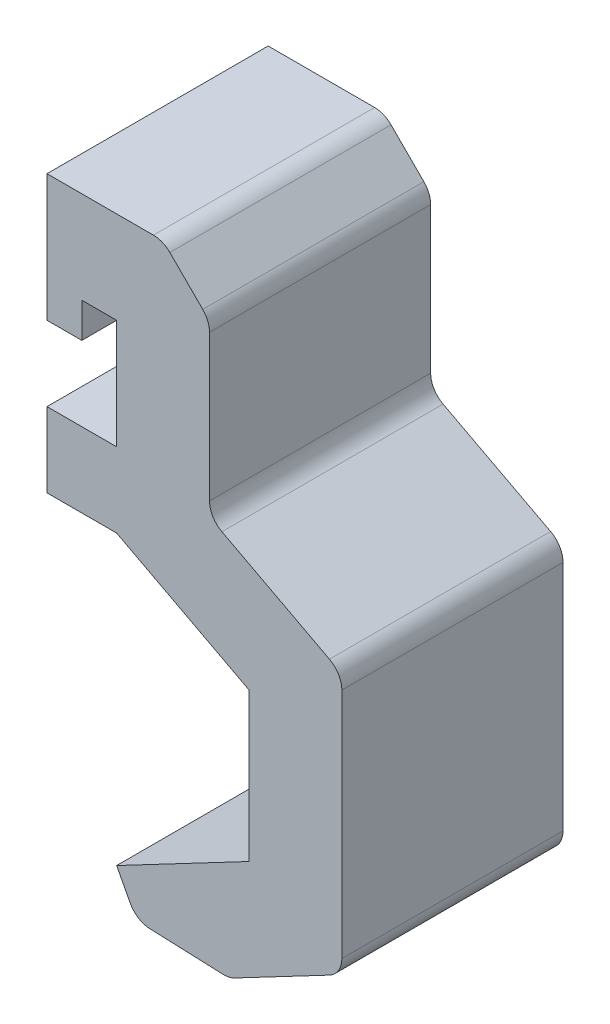
ISO-10303-21;
HEADER;
FILE_DESCRIPTION(('STEP AP214'),'2;1');
FILE_NAME('part.step','',(''),(''),'','','');
FILE_SCHEMA(('AUTOMOTIVE_DESIGN { 1 0 10303 214 1 1 1 1 }'));
ENDSEC;
DATA;
#1=APPLICATION_CONTEXT('core data for automotive mechanical design processes');
#2=APPLICATION_PROTOCOL_DEFINITION('international standard','automotive_design',2000,#1);
#3=PRODUCT_CONTEXT('',#1,'mechanical');
#4=PRODUCT('Part','Part','',(#3));
#5=PRODUCT_RELATED_PRODUCT_CATEGORY('part','',(#4));
#6=PRODUCT_DEFINITION_FORMATION('','',#4);
#7=PRODUCT_DEFINITION_CONTEXT('part definition',#1,'design');
#8=PRODUCT_DEFINITION('design','',#6,#7);
#9=PRODUCT_DEFINITION_SHAPE('','',#8);
#10=(LENGTH_UNIT() NAMED_UNIT(*) SI_UNIT(.MILLI.,.METRE.));
#11=(NAMED_UNIT(*) PLANE_ANGLE_UNIT() SI_UNIT($,.RADIAN.));
#12=(NAMED_UNIT(*) SI_UNIT($,.STERADIAN.) SOLID_ANGLE_UNIT());
#13=UNCERTAINTY_MEASURE_WITH_UNIT(LENGTH_MEASURE(1.E-05),#10,'distance_accuracy_value','');
#14=(GEOMETRIC_REPRESENTATION_CONTEXT(3) GLOBAL_UNCERTAINTY_ASSIGNED_CONTEXT((#13)) GLOBAL_UNIT_ASSIGNED_CONTEXT((#10,
#11,#12)) REPRESENTATION_CONTEXT('',''));
#15=CARTESIAN_POINT('',(0.,0.,0.));
#16=DIRECTION('',(0.,0.,1.));
#17=DIRECTION('',(1.,0.,0.));
#18=AXIS2_PLACEMENT_3D('',#15,#16,#17);
#19=CARTESIAN_POINT('',(22.5,12.6474908997093,4.7625));
#20=DIRECTION('',(0.,1.,0.));
#21=DIRECTION('',(0.,0.,1.));
#22=AXIS2_PLACEMENT_3D('',#19,#20,#21);
#23=PLANE('',#22);
#24=DIRECTION('',(1.,0.,0.));
#25=VECTOR('',#24,1.);
#26=CARTESIAN_POINT('',(22.5,12.6474908997093,0.));
#27=LINE('',#26,#25);
#28=CARTESIAN_POINT('',(21.,12.6474908997093,0.));
#29=VERTEX_POINT('',#28);
#30=CARTESIAN_POINT('',(22.5,12.6474908997093,0.));
#31=VERTEX_POINT('',#30);
#32=EDGE_CURVE('E229',#29,#31,#27,.T.);
#33=ORIENTED_EDGE('',*,*,#32,.T.);
#34=DIRECTION('',(0.,0.,-1.));
#35=VECTOR('',#34,1.);
#36=CARTESIAN_POINT('',(22.5,12.6474908997093,4.7625));
#37=LINE('',#36,#35);
#38=CARTESIAN_POINT('',(22.5,12.6474908997093,4.7625));
#39=VERTEX_POINT('',#38);
#40=EDGE_CURVE('E209',#39,#31,#37,.T.);
#41=ORIENTED_EDGE('',*,*,#40,.F.);
#42=DIRECTION('',(1.,0.,0.));
#43=VECTOR('',#42,1.);
#44=CARTESIAN_POINT('',(22.5,12.6474908997093,4.7625));
#45=LINE('',#44,#43);
#46=CARTESIAN_POINT('',(21.,12.6474908997093,4.7625));
#47=VERTEX_POINT('',#46);
#48=EDGE_CURVE('E216',#47,#39,#45,.T.);
#49=ORIENTED_EDGE('',*,*,#48,.F.);
#50=DIRECTION('',(0.,0.,-1.));
#51=VECTOR('',#50,1.);
#52=CARTESIAN_POINT('',(21.,12.6474908997093,4.7625));
#53=LINE('',#52,#51);
#54=EDGE_CURVE('E361',#47,#29,#53,.T.);
#55=ORIENTED_EDGE('',*,*,#54,.T.);
#56=EDGE_LOOP('',(#33,#41,#49,#55));
#57=FACE_BOUND('',#56,.T.);
#58=ADVANCED_FACE('F30',(#57),#23,.F.);
#59=CARTESIAN_POINT('',(22.5,12.6474908997093,4.7625));
#60=DIRECTION('',(0.465746432832622,0.884918222381983,0.));
#61=DIRECTION('',(-0.884918222381983,0.465746432832622,0.));
#62=AXIS2_PLACEMENT_3D('',#59,#60,#61);
#63=PLANE('',#62);
#64=DIRECTION('',(0.884918222381983,-0.465746432832622,0.));
#65=VECTOR('',#64,1.);
#66=CARTESIAN_POINT('',(22.5,12.6474908997093,0.));
#67=LINE('',#66,#65);
#68=CARTESIAN_POINT('',(25.35,11.1474908997093,0.));
#69=VERTEX_POINT('',#68);
#70=EDGE_CURVE('E363',#31,#69,#67,.T.);
#71=ORIENTED_EDGE('',*,*,#70,.T.);
#72=DIRECTION('',(0.,0.,-1.));
#73=VECTOR('',#72,1.);
#74=CARTESIAN_POINT('',(25.35,11.1474908997093,4.7625));
#75=LINE('',#74,#73);
#76=CARTESIAN_POINT('',(25.35,11.1474908997093,4.7625));
#77=VERTEX_POINT('',#76);
#78=EDGE_CURVE('E212',#77,#69,#75,.T.);
#79=ORIENTED_EDGE('',*,*,#78,.F.);
#80=DIRECTION('',(0.884918222381983,-0.465746432832622,0.));
#81=VECTOR('',#80,1.);
#82=CARTESIAN_POINT('',(22.5,12.6474908997093,4.7625));
#83=LINE('',#82,#81);
#84=EDGE_CURVE('E205',#39,#77,#83,.T.);
#85=ORIENTED_EDGE('',*,*,#84,.F.);
#86=ORIENTED_EDGE('',*,*,#40,.T.);
#87=EDGE_LOOP('',(#71,#79,#85,#86));
#88=FACE_BOUND('',#87,.T.);
#89=ADVANCED_FACE('F207',(#88),#63,.F.);
#90=CARTESIAN_POINT('',(25.35,11.1474908997093,4.7625));
#91=DIRECTION('',(1.,0.,0.));
#92=DIRECTION('',(0.,0.,-1.));
#93=AXIS2_PLACEMENT_3D('',#90,#91,#92);
#94=PLANE('',#93);
#95=DIRECTION('',(0.,-1.,0.));
#96=VECTOR('',#95,1.);
#97=CARTESIAN_POINT('',(25.35,11.1474908997093,0.));
#98=LINE('',#97,#96);
#99=CARTESIAN_POINT('',(25.35,7.94749089970934,0.));
#100=VERTEX_POINT('',#99);
#101=EDGE_CURVE('E365',#69,#100,#98,.T.);
#102=ORIENTED_EDGE('',*,*,#101,.T.);
#103=DIRECTION('',(0.,0.,-1.));
#104=VECTOR('',#103,1.);
#105=CARTESIAN_POINT('',(25.35,7.94749089970934,4.7625));
#106=LINE('',#105,#104);
#107=CARTESIAN_POINT('',(25.35,7.94749089970934,4.7625));
#108=VERTEX_POINT('',#107);
#109=EDGE_CURVE('E235',#108,#100,#106,.T.);
#110=ORIENTED_EDGE('',*,*,#109,.F.);
#111=DIRECTION('',(0.,-1.,0.));
#112=VECTOR('',#111,1.);
#113=CARTESIAN_POINT('',(25.35,11.1474908997093,4.7625));
#114=LINE('',#113,#112);
#115=EDGE_CURVE('E215',#77,#108,#114,.T.);
#116=ORIENTED_EDGE('',*,*,#115,.F.);
#117=ORIENTED_EDGE('',*,*,#78,.T.);
#118=EDGE_LOOP('',(#102,#110,#116,#117));
#119=FACE_BOUND('',#118,.T.);
#120=ADVANCED_FACE('F422',(#119),#94,.F.);
#121=CARTESIAN_POINT('',(25.35,7.94749089970934,4.7625));
#122=DIRECTION('',(0.465746432832622,-0.884918222381983,0.));
#123=DIRECTION('',(0.884918222381983,0.465746432832622,0.));
#124=AXIS2_PLACEMENT_3D('',#121,#122,#123);
#125=PLANE('',#124);
#126=DIRECTION('',(-0.884918222381983,-0.465746432832622,0.));
#127=VECTOR('',#126,1.);
#128=CARTESIAN_POINT('',(25.35,7.94749089970934,0.));
#129=LINE('',#128,#127);
#130=CARTESIAN_POINT('',(22.5,6.44749089970934,0.));
#131=VERTEX_POINT('',#130);
#132=EDGE_CURVE('E319',#100,#131,#129,.T.);
#133=ORIENTED_EDGE('',*,*,#132,.T.);
#134=DIRECTION('',(0.,0.,-1.));
#135=VECTOR('',#134,1.);
#136=CARTESIAN_POINT('',(22.5,6.44749089970934,4.7625));
#137=LINE('',#136,#135);
#138=CARTESIAN_POINT('',(22.5,6.44749089970934,4.7625));
#139=VERTEX_POINT('',#138);
#140=EDGE_CURVE('E317',#139,#131,#137,.T.);
#141=ORIENTED_EDGE('',*,*,#140,.F.);
#142=DIRECTION('',(-0.884918222381983,-0.465746432832622,0.));
#143=VECTOR('',#142,1.);
#144=CARTESIAN_POINT('',(25.35,7.94749089970934,4.7625));
#145=LINE('',#144,#143);
#146=EDGE_CURVE('E337',#108,#139,#145,.T.);
#147=ORIENTED_EDGE('',*,*,#146,.F.);
#148=ORIENTED_EDGE('',*,*,#109,.T.);
#149=EDGE_LOOP('',(#133,#141,#147,#148));
#150=FACE_BOUND('',#149,.T.);
#151=ADVANCED_FACE('F419',(#150),#125,.F.);
#152=CARTESIAN_POINT('',(23.392083301161,4.75253262750349,4.7625));
#153=DIRECTION('',(0.884918222381983,0.465746432832622,0.));
#154=DIRECTION('',(-0.465746432832622,0.884918222381983,0.));
#155=AXIS2_PLACEMENT_3D('',#152,#153,#154);
#156=PLANE('',#155);
#157=DIRECTION('',(0.465746432832621,-0.884918222381983,0.));
#158=VECTOR('',#157,1.);
#159=CARTESIAN_POINT('',(23.392083301161,4.75253262750349,0.));
#160=LINE('',#159,#158);
#161=CARTESIAN_POINT('',(22.7918874541433,5.89290473683699,0.));
#162=VERTEX_POINT('',#161);
#163=EDGE_CURVE('E309',#131,#162,#160,.T.);
#164=ORIENTED_EDGE('',*,*,#163,.T.);
#165=DIRECTION('',(0.,0.,-1.));
#166=VECTOR('',#165,1.);
#167=CARTESIAN_POINT('',(22.7918874541433,5.89290473683699,4.7625));
#168=LINE('',#167,#166);
#169=CARTESIAN_POINT('',(22.7918874541433,5.89290473683699,4.7625));
#170=VERTEX_POINT('',#169);
#171=EDGE_CURVE('E293',#162,#170,#168,.F.);
#172=ORIENTED_EDGE('',*,*,#171,.T.);
#173=DIRECTION('',(0.465746432832621,-0.884918222381983,0.));
#174=VECTOR('',#173,1.);
#175=CARTESIAN_POINT('',(23.392083301161,4.75253262750349,4.7625));
#176=LINE('',#175,#174);
#177=EDGE_CURVE('E323',#139,#170,#176,.T.);
#178=ORIENTED_EDGE('',*,*,#177,.F.);
#179=ORIENTED_EDGE('',*,*,#140,.T.);
#180=EDGE_LOOP('',(#164,#172,#178,#179));
#181=FACE_BOUND('',#180,.T.);
#182=ADVANCED_FACE('F314',(#181),#156,.F.);
#183=CARTESIAN_POINT('',(27.35,6.83564667952403,4.7625));
#184=DIRECTION('',(-0.465746432832622,0.884918222381982,0.));
#185=DIRECTION('',(-0.884918222381983,-0.465746432832622,0.));
#186=AXIS2_PLACEMENT_3D('',#183,#184,#185);
#187=PLANE('',#186);
#188=DIRECTION('',(0.884918222381982,0.465746432832622,0.));
#189=VECTOR('',#188,1.);
#190=CARTESIAN_POINT('',(27.35,6.83564667952403,4.7625));
#191=LINE('',#190,#189);
#192=CARTESIAN_POINT('',(25.0433631843975,5.62162730289114,4.7625));
#193=VERTEX_POINT('',#192);
#194=CARTESIAN_POINT('',(27.0828732164163,6.69505363553261,4.7625));
#195=VERTEX_POINT('',#194);
#196=EDGE_CURVE('E326',#193,#195,#191,.T.);
#197=ORIENTED_EDGE('',*,*,#196,.F.);
#198=DIRECTION('',(0.,0.,1.));
#199=VECTOR('',#198,1.);
#200=CARTESIAN_POINT('',(25.0433631843975,5.62162730289114,0.));
#201=LINE('',#200,#199);
#202=CARTESIAN_POINT('',(25.0433631843975,5.62162730289114,0.));
#203=VERTEX_POINT('',#202);
#204=EDGE_CURVE('E11',#193,#203,#201,.F.);
#205=ORIENTED_EDGE('',*,*,#204,.T.);
#206=DIRECTION('',(0.884918222381982,0.465746432832622,0.));
#207=VECTOR('',#206,1.);
#208=CARTESIAN_POINT('',(27.35,6.83564667952403,0.));
#209=LINE('',#208,#207);
#210=CARTESIAN_POINT('',(27.0828732164163,6.69505363553261,0.));
#211=VERTEX_POINT('',#210);
#212=EDGE_CURVE('E318',#203,#211,#209,.T.);
#213=ORIENTED_EDGE('',*,*,#212,.T.);
#214=DIRECTION('',(0.,0.,-1.));
#215=VECTOR('',#214,1.);
#216=CARTESIAN_POINT('',(27.0828732164163,6.69505363553261,4.7625));
#217=LINE('',#216,#215);
#218=EDGE_CURVE('E255',#211,#195,#217,.F.);
#219=ORIENTED_EDGE('',*,*,#218,.T.);
#220=EDGE_LOOP('',(#197,#205,#213,#219));
#221=FACE_BOUND('',#220,.T.);
#222=ADVANCED_FACE('F328',(#221),#187,.F.);
#223=CARTESIAN_POINT('',(27.35,12.4468795175236,4.7625));
#224=DIRECTION('',(-1.,0.,0.));
#225=DIRECTION('',(0.,0.,1.));
#226=AXIS2_PLACEMENT_3D('',#223,#224,#225);
#227=PLANE('',#226);
#228=DIRECTION('',(0.,1.,0.));
#229=VECTOR('',#228,1.);
#230=CARTESIAN_POINT('',(27.35,12.4468795175236,4.7625));
#231=LINE('',#230,#229);
#232=CARTESIAN_POINT('',(27.35,7.1375127467236,4.7625));
#233=VERTEX_POINT('',#232);
#234=CARTESIAN_POINT('',(27.35,12.145013450324,4.7625));
#235=VERTEX_POINT('',#234);
#236=EDGE_CURVE('E332',#233,#235,#231,.T.);
#237=ORIENTED_EDGE('',*,*,#236,.F.);
#238=DIRECTION('',(0.,0.,-1.));
#239=VECTOR('',#238,1.);
#240=CARTESIAN_POINT('',(27.35,7.1375127467236,4.7625));
#241=LINE('',#240,#239);
#242=CARTESIAN_POINT('',(27.35,7.1375127467236,0.));
#243=VERTEX_POINT('',#242);
#244=EDGE_CURVE('E243',#233,#243,#241,.T.);
#245=ORIENTED_EDGE('',*,*,#244,.T.);
#246=DIRECTION('',(0.,1.,0.));
#247=VECTOR('',#246,1.);
#248=CARTESIAN_POINT('',(27.35,12.4468795175236,0.));
#249=LINE('',#248,#247);
#250=CARTESIAN_POINT('',(27.35,12.145013450324,0.));
#251=VERTEX_POINT('',#250);
#252=EDGE_CURVE('E369',#243,#251,#249,.T.);
#253=ORIENTED_EDGE('',*,*,#252,.T.);
#254=DIRECTION('',(0.,0.,-1.));
#255=VECTOR('',#254,1.);
#256=CARTESIAN_POINT('',(27.35,12.145013450324,4.7625));
#257=LINE('',#256,#255);
#258=EDGE_CURVE('E241',#251,#235,#257,.F.);
#259=ORIENTED_EDGE('',*,*,#258,.T.);
#260=EDGE_LOOP('',(#237,#245,#253,#259));
#261=FACE_BOUND('',#260,.T.);
#262=ADVANCED_FACE('F508',(#261),#227,.F.);
#263=CARTESIAN_POINT('',(24.5,13.9468795175236,4.7625));
#264=DIRECTION('',(-0.465746432832622,-0.884918222381982,0.));
#265=DIRECTION('',(0.884918222381983,-0.465746432832622,0.));
#266=AXIS2_PLACEMENT_3D('',#263,#264,#265);
#267=PLANE('',#266);
#268=DIRECTION('',(-0.884918222381982,0.465746432832622,0.));
#269=VECTOR('',#268,1.);
#270=CARTESIAN_POINT('',(24.5,13.9468795175236,4.7625));
#271=LINE('',#270,#269);
#272=CARTESIAN_POINT('',(27.0828732164163,12.587472561515,4.7625));
#273=VERTEX_POINT('',#272);
#274=CARTESIAN_POINT('',(24.7671267835837,13.8062864735322,4.7625));
#275=VERTEX_POINT('',#274);
#276=EDGE_CURVE('E335',#273,#275,#271,.T.);
#277=ORIENTED_EDGE('',*,*,#276,.F.);
#278=DIRECTION('',(0.,0.,-1.));
#279=VECTOR('',#278,1.);
#280=CARTESIAN_POINT('',(27.0828732164163,12.587472561515,4.7625));
#281=LINE('',#280,#279);
#282=CARTESIAN_POINT('',(27.0828732164163,12.587472561515,0.));
#283=VERTEX_POINT('',#282);
#284=EDGE_CURVE('E268',#273,#283,#281,.T.);
#285=ORIENTED_EDGE('',*,*,#284,.T.);
#286=DIRECTION('',(-0.884918222381982,0.465746432832622,0.));
#287=VECTOR('',#286,1.);
#288=CARTESIAN_POINT('',(24.5,13.9468795175236,0.));
#289=LINE('',#288,#287);
#290=CARTESIAN_POINT('',(24.7671267835837,13.8062864735322,0.));
#291=VERTEX_POINT('',#290);
#292=EDGE_CURVE('E372',#283,#291,#289,.T.);
#293=ORIENTED_EDGE('',*,*,#292,.T.);
#294=DIRECTION('',(0.,0.,-1.));
#295=VECTOR('',#294,1.);
#296=CARTESIAN_POINT('',(24.7671267835837,13.8062864735322,4.7625));
#297=LINE('',#296,#295);
#298=EDGE_CURVE('E266',#291,#275,#297,.F.);
#299=ORIENTED_EDGE('',*,*,#298,.T.);
#300=EDGE_LOOP('',(#277,#285,#293,#299));
#301=FACE_BOUND('',#300,.T.);
#302=ADVANCED_FACE('F577',(#301),#267,.F.);
#303=CARTESIAN_POINT('',(24.5,18.6006158997093,4.7625));
#304=DIRECTION('',(-1.,0.,0.));
#305=DIRECTION('',(0.,0.,1.));
#306=AXIS2_PLACEMENT_3D('',#303,#304,#305);
#307=PLANE('',#306);
#308=DIRECTION('',(0.,1.,0.));
#309=VECTOR('',#308,1.);
#310=CARTESIAN_POINT('',(24.5,18.6006158997093,4.7625));
#311=LINE('',#310,#309);
#312=CARTESIAN_POINT('',(24.5,14.2487455847232,4.7625));
#313=VERTEX_POINT('',#312);
#314=CARTESIAN_POINT('',(24.5,17.3935091185228,4.7625));
#315=VERTEX_POINT('',#314);
#316=EDGE_CURVE('E343',#313,#315,#311,.T.);
#317=ORIENTED_EDGE('',*,*,#316,.F.);
#318=DIRECTION('',(0.,0.,-1.));
#319=VECTOR('',#318,1.);
#320=CARTESIAN_POINT('',(24.5,14.2487455847232,0.));
#321=LINE('',#320,#319);
#322=CARTESIAN_POINT('',(24.5,14.2487455847232,0.));
#323=VERTEX_POINT('',#322);
#324=EDGE_CURVE('E274',#313,#323,#321,.T.);
#325=ORIENTED_EDGE('',*,*,#324,.T.);
#326=DIRECTION('',(0.,1.,0.));
#327=VECTOR('',#326,1.);
#328=CARTESIAN_POINT('',(24.5,18.6006158997093,0.));
#329=LINE('',#328,#327);
#330=CARTESIAN_POINT('',(24.5,17.3935091185228,0.));
#331=VERTEX_POINT('',#330);
#332=EDGE_CURVE('E375',#323,#331,#329,.T.);
#333=ORIENTED_EDGE('',*,*,#332,.T.);
#334=DIRECTION('',(0.,0.,-1.));
#335=VECTOR('',#334,1.);
#336=CARTESIAN_POINT('',(24.5,17.3935091185228,4.7625));
#337=LINE('',#336,#335);
#338=EDGE_CURVE('E271',#331,#315,#337,.F.);
#339=ORIENTED_EDGE('',*,*,#338,.T.);
#340=EDGE_LOOP('',(#317,#325,#333,#339));
#341=FACE_BOUND('',#340,.T.);
#342=ADVANCED_FACE('F564',(#341),#307,.F.);
#343=CARTESIAN_POINT('',(22.5,18.6006158997093,4.7625));
#344=DIRECTION('',(0.,-1.,0.));
#345=DIRECTION('',(1.,0.,0.));
#346=AXIS2_PLACEMENT_3D('',#343,#344,#345);
#347=PLANE('',#346);
#348=DIRECTION('',(-1.,0.,0.));
#349=VECTOR('',#348,1.);
#350=CARTESIAN_POINT('',(22.5,18.6006158997093,4.7625));
#351=LINE('',#350,#349);
#352=CARTESIAN_POINT('',(23.2928932188135,18.6006158997093,4.7625));
#353=VERTEX_POINT('',#352);
#354=CARTESIAN_POINT('',(21.,18.6006158997093,4.7625));
#355=VERTEX_POINT('',#354);
#356=EDGE_CURVE('E346',#353,#355,#351,.T.);
#357=ORIENTED_EDGE('',*,*,#356,.F.);
#358=DIRECTION('',(0.,0.,1.));
#359=VECTOR('',#358,1.);
#360=CARTESIAN_POINT('',(23.2928932188135,18.6006158997093,0.));
#361=LINE('',#360,#359);
#362=CARTESIAN_POINT('',(23.2928932188135,18.6006158997093,0.));
#363=VERTEX_POINT('',#362);
#364=EDGE_CURVE('E281',#353,#363,#361,.F.);
#365=ORIENTED_EDGE('',*,*,#364,.T.);
#366=DIRECTION('',(-1.,0.,0.));
#367=VECTOR('',#366,1.);
#368=CARTESIAN_POINT('',(22.5,18.6006158997093,0.));
#369=LINE('',#368,#367);
#370=CARTESIAN_POINT('',(21.,18.6006158997093,0.));
#371=VERTEX_POINT('',#370);
#372=EDGE_CURVE('E378',#363,#371,#369,.T.);
#373=ORIENTED_EDGE('',*,*,#372,.T.);
#374=DIRECTION('',(0.,0.,-1.));
#375=VECTOR('',#374,1.);
#376=CARTESIAN_POINT('',(21.,18.6006158997093,4.7625));
#377=LINE('',#376,#375);
#378=EDGE_CURVE('E412',#355,#371,#377,.T.);
#379=ORIENTED_EDGE('',*,*,#378,.F.);
#380=EDGE_LOOP('',(#357,#365,#373,#379));
#381=FACE_BOUND('',#380,.T.);
#382=ADVANCED_FACE('F558',(#381),#347,.F.);
#383=CARTESIAN_POINT('',(21.,16.6162408997093,4.7625));
#384=DIRECTION('',(1.,0.,0.));
#385=DIRECTION('',(0.,0.,-1.));
#386=AXIS2_PLACEMENT_3D('',#383,#384,#385);
#387=PLANE('',#386);
#388=DIRECTION('',(0.,-1.,0.));
#389=VECTOR('',#388,1.);
#390=CARTESIAN_POINT('',(21.,16.6162408997093,0.));
#391=LINE('',#390,#389);
#392=CARTESIAN_POINT('',(21.,15.8662408997093,0.));
#393=VERTEX_POINT('',#392);
#394=EDGE_CURVE('E380',#371,#393,#391,.T.);
#395=ORIENTED_EDGE('',*,*,#394,.T.);
#396=DIRECTION('',(0.,0.,-1.));
#397=VECTOR('',#396,1.);
#398=CARTESIAN_POINT('',(21.,15.8662408997093,4.7625));
#399=LINE('',#398,#397);
#400=CARTESIAN_POINT('',(21.,15.8662408997093,4.7625));
#401=VERTEX_POINT('',#400);
#402=EDGE_CURVE('E409',#401,#393,#399,.T.);
#403=ORIENTED_EDGE('',*,*,#402,.F.);
#404=DIRECTION('',(0.,-1.,0.));
#405=VECTOR('',#404,1.);
#406=CARTESIAN_POINT('',(21.,16.6162408997093,4.7625));
#407=LINE('',#406,#405);
#408=EDGE_CURVE('E348',#355,#401,#407,.T.);
#409=ORIENTED_EDGE('',*,*,#408,.F.);
#410=ORIENTED_EDGE('',*,*,#378,.T.);
#411=EDGE_LOOP('',(#395,#403,#409,#410));
#412=FACE_BOUND('',#411,.T.);
#413=ADVANCED_FACE('F563',(#412),#387,.F.);
#414=CARTESIAN_POINT('',(21.,15.8662408997093,4.7625));
#415=DIRECTION('',(0.,1.,0.));
#416=DIRECTION('',(0.,0.,1.));
#417=AXIS2_PLACEMENT_3D('',#414,#415,#416);
#418=PLANE('',#417);
#419=DIRECTION('',(1.,0.,0.));
#420=VECTOR('',#419,1.);
#421=CARTESIAN_POINT('',(21.,15.8662408997093,0.));
#422=LINE('',#421,#420);
#423=CARTESIAN_POINT('',(21.75,15.8662408997093,0.));
#424=VERTEX_POINT('',#423);
#425=EDGE_CURVE('E382',#393,#424,#422,.T.);
#426=ORIENTED_EDGE('',*,*,#425,.T.);
#427=DIRECTION('',(0.,0.,-1.));
#428=VECTOR('',#427,1.);
#429=CARTESIAN_POINT('',(21.75,15.8662408997093,4.7625));
#430=LINE('',#429,#428);
#431=CARTESIAN_POINT('',(21.75,15.8662408997093,4.7625));
#432=VERTEX_POINT('',#431);
#433=EDGE_CURVE('E406',#432,#424,#430,.T.);
#434=ORIENTED_EDGE('',*,*,#433,.F.);
#435=DIRECTION('',(1.,0.,0.));
#436=VECTOR('',#435,1.);
#437=CARTESIAN_POINT('',(21.,15.8662408997093,4.7625));
#438=LINE('',#437,#436);
#439=EDGE_CURVE('E350',#401,#432,#438,.T.);
#440=ORIENTED_EDGE('',*,*,#439,.F.);
#441=ORIENTED_EDGE('',*,*,#402,.T.);
#442=EDGE_LOOP('',(#426,#434,#440,#441));
#443=FACE_BOUND('',#442,.T.);
#444=ADVANCED_FACE('F641',(#443),#418,.F.);
#445=CARTESIAN_POINT('',(21.75,16.6162408997093,4.7625));
#446=DIRECTION('',(-1.,0.,0.));
#447=DIRECTION('',(0.,0.,1.));
#448=AXIS2_PLACEMENT_3D('',#445,#446,#447);
#449=PLANE('',#448);
#450=DIRECTION('',(0.,1.,0.));
#451=VECTOR('',#450,1.);
#452=CARTESIAN_POINT('',(21.75,16.6162408997093,0.));
#453=LINE('',#452,#451);
#454=CARTESIAN_POINT('',(21.75,16.6162408997093,0.));
#455=VERTEX_POINT('',#454);
#456=EDGE_CURVE('E384',#424,#455,#453,.T.);
#457=ORIENTED_EDGE('',*,*,#456,.T.);
#458=DIRECTION('',(0.,0.,-1.));
#459=VECTOR('',#458,1.);
#460=CARTESIAN_POINT('',(21.75,16.6162408997093,4.7625));
#461=LINE('',#460,#459);
#462=CARTESIAN_POINT('',(21.75,16.6162408997093,4.7625));
#463=VERTEX_POINT('',#462);
#464=EDGE_CURVE('E403',#463,#455,#461,.T.);
#465=ORIENTED_EDGE('',*,*,#464,.F.);
#466=DIRECTION('',(0.,1.,0.));
#467=VECTOR('',#466,1.);
#468=CARTESIAN_POINT('',(21.75,16.6162408997093,4.7625));
#469=LINE('',#468,#467);
#470=EDGE_CURVE('E352',#432,#463,#469,.T.);
#471=ORIENTED_EDGE('',*,*,#470,.F.);
#472=ORIENTED_EDGE('',*,*,#433,.T.);
#473=EDGE_LOOP('',(#457,#465,#471,#472));
#474=FACE_BOUND('',#473,.T.);
#475=ADVANCED_FACE('F631',(#474),#449,.F.);
#476=CARTESIAN_POINT('',(22.5,16.6162408997093,4.7625));
#477=DIRECTION('',(0.,1.,0.));
#478=DIRECTION('',(-1.,0.,0.));
#479=AXIS2_PLACEMENT_3D('',#476,#477,#478);
#480=PLANE('',#479);
#481=DIRECTION('',(1.,0.,0.));
#482=VECTOR('',#481,1.);
#483=CARTESIAN_POINT('',(22.5,16.6162408997093,0.));
#484=LINE('',#483,#482);
#485=CARTESIAN_POINT('',(22.5,16.6162408997093,0.));
#486=VERTEX_POINT('',#485);
#487=EDGE_CURVE('E386',#455,#486,#484,.T.);
#488=ORIENTED_EDGE('',*,*,#487,.T.);
#489=DIRECTION('',(0.,0.,-1.));
#490=VECTOR('',#489,1.);
#491=CARTESIAN_POINT('',(22.5,16.6162408997093,4.7625));
#492=LINE('',#491,#490);
#493=CARTESIAN_POINT('',(22.5,16.6162408997093,4.7625));
#494=VERTEX_POINT('',#493);
#495=EDGE_CURVE('E400',#494,#486,#492,.T.);
#496=ORIENTED_EDGE('',*,*,#495,.F.);
#497=DIRECTION('',(1.,0.,0.));
#498=VECTOR('',#497,1.);
#499=CARTESIAN_POINT('',(22.5,16.6162408997093,4.7625));
#500=LINE('',#499,#498);
#501=EDGE_CURVE('E354',#463,#494,#500,.T.);
#502=ORIENTED_EDGE('',*,*,#501,.F.);
#503=ORIENTED_EDGE('',*,*,#464,.T.);
#504=EDGE_LOOP('',(#488,#496,#502,#503));
#505=FACE_BOUND('',#504,.T.);
#506=ADVANCED_FACE('F621',(#505),#480,.F.);
#507=CARTESIAN_POINT('',(22.5,14.2568658997093,4.7625));
#508=DIRECTION('',(1.,0.,0.));
#509=DIRECTION('',(0.,0.,-1.));
#510=AXIS2_PLACEMENT_3D('',#507,#508,#509);
#511=PLANE('',#510);
#512=DIRECTION('',(0.,-1.,0.));
#513=VECTOR('',#512,1.);
#514=CARTESIAN_POINT('',(22.5,14.2568658997093,0.));
#515=LINE('',#514,#513);
#516=CARTESIAN_POINT('',(22.5,14.2568658997093,0.));
#517=VERTEX_POINT('',#516);
#518=EDGE_CURVE('E388',#486,#517,#515,.T.);
#519=ORIENTED_EDGE('',*,*,#518,.T.);
#520=DIRECTION('',(0.,0.,-1.));
#521=VECTOR('',#520,1.);
#522=CARTESIAN_POINT('',(22.5,14.2568658997093,4.7625));
#523=LINE('',#522,#521);
#524=CARTESIAN_POINT('',(22.5,14.2568658997093,4.7625));
#525=VERTEX_POINT('',#524);
#526=EDGE_CURVE('E397',#525,#517,#523,.T.);
#527=ORIENTED_EDGE('',*,*,#526,.F.);
#528=DIRECTION('',(0.,-1.,0.));
#529=VECTOR('',#528,1.);
#530=CARTESIAN_POINT('',(22.5,14.2568658997093,4.7625));
#531=LINE('',#530,#529);
#532=EDGE_CURVE('E356',#494,#525,#531,.T.);
#533=ORIENTED_EDGE('',*,*,#532,.F.);
#534=ORIENTED_EDGE('',*,*,#495,.T.);
#535=EDGE_LOOP('',(#519,#527,#533,#534));
#536=FACE_BOUND('',#535,.T.);
#537=ADVANCED_FACE('F611',(#536),#511,.F.);
#538=CARTESIAN_POINT('',(21.,14.2568658997093,4.7625));
#539=DIRECTION('',(0.,-1.,0.));
#540=DIRECTION('',(0.,0.,-1.));
#541=AXIS2_PLACEMENT_3D('',#538,#539,#540);
#542=PLANE('',#541);
#543=DIRECTION('',(-1.,0.,0.));
#544=VECTOR('',#543,1.);
#545=CARTESIAN_POINT('',(21.,14.2568658997093,0.));
#546=LINE('',#545,#544);
#547=CARTESIAN_POINT('',(21.,14.2568658997093,0.));
#548=VERTEX_POINT('',#547);
#549=EDGE_CURVE('E390',#517,#548,#546,.T.);
#550=ORIENTED_EDGE('',*,*,#549,.T.);
#551=DIRECTION('',(0.,0.,-1.));
#552=VECTOR('',#551,1.);
#553=CARTESIAN_POINT('',(21.,14.2568658997093,4.7625));
#554=LINE('',#553,#552);
#555=CARTESIAN_POINT('',(21.,14.2568658997093,4.7625));
#556=VERTEX_POINT('',#555);
#557=EDGE_CURVE('E394',#556,#548,#554,.T.);
#558=ORIENTED_EDGE('',*,*,#557,.F.);
#559=DIRECTION('',(-1.,0.,0.));
#560=VECTOR('',#559,1.);
#561=CARTESIAN_POINT('',(21.,14.2568658997093,4.7625));
#562=LINE('',#561,#560);
#563=EDGE_CURVE('E358',#525,#556,#562,.T.);
#564=ORIENTED_EDGE('',*,*,#563,.F.);
#565=ORIENTED_EDGE('',*,*,#526,.T.);
#566=EDGE_LOOP('',(#550,#558,#564,#565));
#567=FACE_BOUND('',#566,.T.);
#568=ADVANCED_FACE('F601',(#567),#542,.F.);
#569=CARTESIAN_POINT('',(21.,14.2568658997093,4.7625));
#570=DIRECTION('',(1.,0.,0.));
#571=DIRECTION('',(0.,1.,0.));
#572=AXIS2_PLACEMENT_3D('',#569,#570,#571);
#573=PLANE('',#572);
#574=DIRECTION('',(0.,-1.,0.));
#575=VECTOR('',#574,1.);
#576=CARTESIAN_POINT('',(21.,14.2568658997093,0.));
#577=LINE('',#576,#575);
#578=EDGE_CURVE('E226',#548,#29,#577,.T.);
#579=ORIENTED_EDGE('',*,*,#578,.T.);
#580=ORIENTED_EDGE('',*,*,#54,.F.);
#581=DIRECTION('',(0.,-1.,0.));
#582=VECTOR('',#581,1.);
#583=CARTESIAN_POINT('',(21.,14.2568658997093,4.7625));
#584=LINE('',#583,#582);
#585=EDGE_CURVE('E222',#556,#47,#584,.T.);
#586=ORIENTED_EDGE('',*,*,#585,.F.);
#587=ORIENTED_EDGE('',*,*,#557,.T.);
#588=EDGE_LOOP('',(#579,#580,#586,#587));
#589=FACE_BOUND('',#588,.T.);
#590=ADVANCED_FACE('F497',(#589),#573,.F.);
#591=CARTESIAN_POINT('',(21.,12.6474908997093,4.7625));
#592=DIRECTION('',(0.,0.,1.));
#593=DIRECTION('',(1.,0.,0.));
#594=AXIS2_PLACEMENT_3D('',#591,#592,#593);
#595=PLANE('',#594);
#596=ORIENTED_EDGE('',*,*,#177,.T.);
#597=CARTESIAN_POINT('',(23.2343465653343,6.1257779532533,4.7625));
#598=DIRECTION('',(0.,0.,1.));
#599=DIRECTION('',(1.,0.,0.));
#600=AXIS2_PLACEMENT_3D('',#597,#598,#599);
#601=CIRCLE('',#600,0.5);
#602=CARTESIAN_POINT('',(23.2147911310164,5.62616051461787,4.7625));
#603=VERTEX_POINT('',#602);
#604=EDGE_CURVE('E298',#170,#603,#601,.T.);
#605=ORIENTED_EDGE('',*,*,#604,.T.);
#606=DIRECTION('',(-0.999234877270875,0.0391108686359593,0.));
#607=VECTOR('',#606,1.);
#608=CARTESIAN_POINT('',(20.7289876577666,5.72345689138427,4.7625));
#609=LINE('',#608,#607);
#610=CARTESIAN_POINT('',(24.7909345336632,5.56446897544669,4.7625));
#611=VERTEX_POINT('',#610);
#612=EDGE_CURVE('E290',#603,#611,#609,.F.);
#613=ORIENTED_EDGE('',*,*,#612,.T.);
#614=CARTESIAN_POINT('',(24.8104899679812,6.06408641408213,4.7625));
#615=DIRECTION('',(0.,0.,1.));
#616=DIRECTION('',(1.,0.,0.));
#617=AXIS2_PLACEMENT_3D('',#614,#615,#616);
#618=CIRCLE('',#617,0.5);
#619=EDGE_CURVE('E296',#611,#193,#618,.T.);
#620=ORIENTED_EDGE('',*,*,#619,.T.);
#621=ORIENTED_EDGE('',*,*,#196,.T.);
#622=CARTESIAN_POINT('',(26.85,7.1375127467236,4.7625));
#623=DIRECTION('',(0.,0.,1.));
#624=DIRECTION('',(1.,0.,0.));
#625=AXIS2_PLACEMENT_3D('',#622,#623,#624);
#626=CIRCLE('',#625,0.5);
#627=EDGE_CURVE('E264',#195,#233,#626,.T.);
#628=ORIENTED_EDGE('',*,*,#627,.T.);
#629=ORIENTED_EDGE('',*,*,#236,.T.);
#630=CARTESIAN_POINT('',(26.85,12.145013450324,4.7625));
#631=DIRECTION('',(0.,0.,1.));
#632=DIRECTION('',(1.,0.,0.));
#633=AXIS2_PLACEMENT_3D('',#630,#631,#632);
#634=CIRCLE('',#633,0.5);
#635=EDGE_CURVE('E262',#235,#273,#634,.T.);
#636=ORIENTED_EDGE('',*,*,#635,.T.);
#637=ORIENTED_EDGE('',*,*,#276,.T.);
#638=CARTESIAN_POINT('',(25.,14.2487455847232,4.7625));
#639=DIRECTION('',(0.,0.,1.));
#640=DIRECTION('',(1.,0.,0.));
#641=AXIS2_PLACEMENT_3D('',#638,#639,#640);
#642=CIRCLE('',#641,0.5);
#643=EDGE_CURVE('E286',#275,#313,#642,.F.);
#644=ORIENTED_EDGE('',*,*,#643,.T.);
#645=ORIENTED_EDGE('',*,*,#316,.T.);
#646=CARTESIAN_POINT('',(24.,17.3935091185228,4.7625));
#647=DIRECTION('',(0.,0.,1.));
#648=DIRECTION('',(1.,0.,0.));
#649=AXIS2_PLACEMENT_3D('',#646,#647,#648);
#650=CIRCLE('',#649,0.5);
#651=CARTESIAN_POINT('',(24.3535533905933,17.7470625091161,4.7625));
#652=VERTEX_POINT('',#651);
#653=EDGE_CURVE('E260',#315,#652,#650,.T.);
#654=ORIENTED_EDGE('',*,*,#653,.T.);
#655=DIRECTION('',(0.707106781186548,-0.707106781186548,0.));
#656=VECTOR('',#655,1.);
#657=CARTESIAN_POINT('',(25.2265625,16.8740533997093,4.7625));
#658=LINE('',#657,#656);
#659=CARTESIAN_POINT('',(23.6464466094067,18.4541692903026,4.7625));
#660=VERTEX_POINT('',#659);
#661=EDGE_CURVE('E233',#652,#660,#658,.F.);
#662=ORIENTED_EDGE('',*,*,#661,.T.);
#663=CARTESIAN_POINT('',(23.2928932188135,18.1006158997093,4.7625));
#664=DIRECTION('',(0.,0.,1.));
#665=DIRECTION('',(1.,0.,0.));
#666=AXIS2_PLACEMENT_3D('',#663,#664,#665);
#667=CIRCLE('',#666,0.5);
#668=EDGE_CURVE('E258',#660,#353,#667,.T.);
#669=ORIENTED_EDGE('',*,*,#668,.T.);
#670=ORIENTED_EDGE('',*,*,#356,.T.);
#671=ORIENTED_EDGE('',*,*,#408,.T.);
#672=ORIENTED_EDGE('',*,*,#439,.T.);
#673=ORIENTED_EDGE('',*,*,#470,.T.);
#674=ORIENTED_EDGE('',*,*,#501,.T.);
#675=ORIENTED_EDGE('',*,*,#532,.T.);
#676=ORIENTED_EDGE('',*,*,#563,.T.);
#677=ORIENTED_EDGE('',*,*,#585,.T.);
#678=ORIENTED_EDGE('',*,*,#48,.T.);
#679=ORIENTED_EDGE('',*,*,#84,.T.);
#680=ORIENTED_EDGE('',*,*,#115,.T.);
#681=ORIENTED_EDGE('',*,*,#146,.T.);
#682=EDGE_LOOP('',(#596,#605,#613,#620,#621,#628,#629,#636,#637,#644,#645,#654,#662,#669,#670,
#671,#672,#673,#674,#675,#676,#677,#678,#679,#680,#681));
#683=FACE_BOUND('',#682,.T.);
#684=ADVANCED_FACE('F220',(#683),#595,.T.);
#685=CARTESIAN_POINT('',(21.,12.6474908997093,0.));
#686=DIRECTION('',(0.,0.,1.));
#687=DIRECTION('',(1.,0.,0.));
#688=AXIS2_PLACEMENT_3D('',#685,#686,#687);
#689=PLANE('',#688);
#690=DIRECTION('',(0.999234877270875,-0.0391108686359593,0.));
#691=VECTOR('',#690,1.);
#692=CARTESIAN_POINT('',(24.9248066228701,5.55922911261355,0.));
#693=LINE('',#692,#691);
#694=CARTESIAN_POINT('',(24.7909345336632,5.56446897544669,0.));
#695=VERTEX_POINT('',#694);
#696=CARTESIAN_POINT('',(23.2147911310164,5.62616051461787,0.));
#697=VERTEX_POINT('',#696);
#698=EDGE_CURVE('E288',#695,#697,#693,.F.);
#699=ORIENTED_EDGE('',*,*,#698,.T.);
#700=CARTESIAN_POINT('',(23.2343465653343,6.1257779532533,0.));
#701=DIRECTION('',(0.,0.,1.));
#702=DIRECTION('',(1.,0.,0.));
#703=AXIS2_PLACEMENT_3D('',#700,#701,#702);
#704=CIRCLE('',#703,0.5);
#705=EDGE_CURVE('E38',#697,#162,#704,.F.);
#706=ORIENTED_EDGE('',*,*,#705,.T.);
#707=ORIENTED_EDGE('',*,*,#163,.F.);
#708=ORIENTED_EDGE('',*,*,#132,.F.);
#709=ORIENTED_EDGE('',*,*,#101,.F.);
#710=ORIENTED_EDGE('',*,*,#70,.F.);
#711=ORIENTED_EDGE('',*,*,#32,.F.);
#712=ORIENTED_EDGE('',*,*,#578,.F.);
#713=ORIENTED_EDGE('',*,*,#549,.F.);
#714=ORIENTED_EDGE('',*,*,#518,.F.);
#715=ORIENTED_EDGE('',*,*,#487,.F.);
#716=ORIENTED_EDGE('',*,*,#456,.F.);
#717=ORIENTED_EDGE('',*,*,#425,.F.);
#718=ORIENTED_EDGE('',*,*,#394,.F.);
#719=ORIENTED_EDGE('',*,*,#372,.F.);
#720=CARTESIAN_POINT('',(23.2928932188135,18.1006158997093,0.));
#721=DIRECTION('',(0.,0.,1.));
#722=DIRECTION('',(1.,0.,0.));
#723=AXIS2_PLACEMENT_3D('',#720,#721,#722);
#724=CIRCLE('',#723,0.5);
#725=CARTESIAN_POINT('',(23.6464466094067,18.4541692903026,0.));
#726=VERTEX_POINT('',#725);
#727=EDGE_CURVE('E246',#363,#726,#724,.F.);
#728=ORIENTED_EDGE('',*,*,#727,.T.);
#729=DIRECTION('',(-0.707106781186548,0.707106781186548,0.));
#730=VECTOR('',#729,1.);
#731=CARTESIAN_POINT('',(23.5,18.6006158997093,0.));
#732=LINE('',#731,#730);
#733=CARTESIAN_POINT('',(24.3535533905933,17.7470625091161,0.));
#734=VERTEX_POINT('',#733);
#735=EDGE_CURVE('E230',#726,#734,#732,.F.);
#736=ORIENTED_EDGE('',*,*,#735,.T.);
#737=CARTESIAN_POINT('',(24.,17.3935091185228,0.));
#738=DIRECTION('',(0.,0.,1.));
#739=DIRECTION('',(1.,0.,0.));
#740=AXIS2_PLACEMENT_3D('',#737,#738,#739);
#741=CIRCLE('',#740,0.5);
#742=EDGE_CURVE('E248',#734,#331,#741,.F.);
#743=ORIENTED_EDGE('',*,*,#742,.T.);
#744=ORIENTED_EDGE('',*,*,#332,.F.);
#745=CARTESIAN_POINT('',(25.,14.2487455847232,0.));
#746=DIRECTION('',(0.,0.,1.));
#747=DIRECTION('',(1.,0.,0.));
#748=AXIS2_PLACEMENT_3D('',#745,#746,#747);
#749=CIRCLE('',#748,0.5);
#750=EDGE_CURVE('E284',#323,#291,#749,.T.);
#751=ORIENTED_EDGE('',*,*,#750,.T.);
#752=ORIENTED_EDGE('',*,*,#292,.F.);
#753=CARTESIAN_POINT('',(26.85,12.145013450324,0.));
#754=DIRECTION('',(0.,0.,1.));
#755=DIRECTION('',(1.,0.,0.));
#756=AXIS2_PLACEMENT_3D('',#753,#754,#755);
#757=CIRCLE('',#756,0.5);
#758=EDGE_CURVE('E250',#283,#251,#757,.F.);
#759=ORIENTED_EDGE('',*,*,#758,.T.);
#760=ORIENTED_EDGE('',*,*,#252,.F.);
#761=CARTESIAN_POINT('',(26.85,7.1375127467236,0.));
#762=DIRECTION('',(0.,0.,1.));
#763=DIRECTION('',(1.,0.,0.));
#764=AXIS2_PLACEMENT_3D('',#761,#762,#763);
#765=CIRCLE('',#764,0.5);
#766=EDGE_CURVE('E252',#243,#211,#765,.F.);
#767=ORIENTED_EDGE('',*,*,#766,.T.);
#768=ORIENTED_EDGE('',*,*,#212,.F.);
#769=CARTESIAN_POINT('',(24.8104899679812,6.06408641408213,0.));
#770=DIRECTION('',(0.,0.,1.));
#771=DIRECTION('',(1.,0.,0.));
#772=AXIS2_PLACEMENT_3D('',#769,#770,#771);
#773=CIRCLE('',#772,0.5);
#774=EDGE_CURVE('E45',#203,#695,#773,.F.);
#775=ORIENTED_EDGE('',*,*,#774,.T.);
#776=EDGE_LOOP('',(#699,#706,#707,#708,#709,#710,#711,#712,#713,#714,#715,#716,#717,#718,#719,
#728,#736,#743,#744,#751,#752,#759,#760,#767,#768,#775));
#777=FACE_BOUND('',#776,.T.);
#778=ADVANCED_FACE('F307',(#777),#689,.F.);
#779=CARTESIAN_POINT('',(23.5,18.6006158997093,4.7625));
#780=DIRECTION('',(-0.707106781186548,-0.707106781186548,0.));
#781=DIRECTION('',(0.707106781186548,-0.707106781186548,0.));
#782=AXIS2_PLACEMENT_3D('',#779,#780,#781);
#783=PLANE('',#782);
#784=ORIENTED_EDGE('',*,*,#661,.F.);
#785=DIRECTION('',(0.,0.,1.));
#786=VECTOR('',#785,1.);
#787=CARTESIAN_POINT('',(24.3535533905933,17.7470625091161,0.));
#788=LINE('',#787,#786);
#789=EDGE_CURVE('E279',#652,#734,#788,.F.);
#790=ORIENTED_EDGE('',*,*,#789,.T.);
#791=ORIENTED_EDGE('',*,*,#735,.F.);
#792=DIRECTION('',(0.,0.,-1.));
#793=VECTOR('',#792,1.);
#794=CARTESIAN_POINT('',(23.6464466094067,18.4541692903026,4.7625));
#795=LINE('',#794,#793);
#796=EDGE_CURVE('E277',#726,#660,#795,.F.);
#797=ORIENTED_EDGE('',*,*,#796,.T.);
#798=EDGE_LOOP('',(#784,#790,#791,#797));
#799=FACE_BOUND('',#798,.T.);
#800=ADVANCED_FACE('F437',(#799),#783,.F.);
#801=CARTESIAN_POINT('',(26.85,7.1375127467236,4.7625));
#802=DIRECTION('',(0.,0.,-1.));
#803=DIRECTION('',(-1.,0.,0.));
#804=AXIS2_PLACEMENT_3D('',#801,#802,#803);
#805=CYLINDRICAL_SURFACE('',#804,0.5);
#806=ORIENTED_EDGE('',*,*,#627,.F.);
#807=ORIENTED_EDGE('',*,*,#218,.F.);
#808=ORIENTED_EDGE('',*,*,#766,.F.);
#809=ORIENTED_EDGE('',*,*,#244,.F.);
#810=EDGE_LOOP('',(#806,#807,#808,#809));
#811=FACE_BOUND('',#810,.T.);
#812=ADVANCED_FACE('F440',(#811),#805,.T.);
#813=CARTESIAN_POINT('',(26.85,12.145013450324,4.7625));
#814=DIRECTION('',(0.,0.,-1.));
#815=DIRECTION('',(-1.,0.,0.));
#816=AXIS2_PLACEMENT_3D('',#813,#814,#815);
#817=CYLINDRICAL_SURFACE('',#816,0.5);
#818=ORIENTED_EDGE('',*,*,#635,.F.);
#819=ORIENTED_EDGE('',*,*,#258,.F.);
#820=ORIENTED_EDGE('',*,*,#758,.F.);
#821=ORIENTED_EDGE('',*,*,#284,.F.);
#822=EDGE_LOOP('',(#818,#819,#820,#821));
#823=FACE_BOUND('',#822,.T.);
#824=ADVANCED_FACE('F444',(#823),#817,.T.);
#825=CARTESIAN_POINT('',(25.,14.2487455847232,4.7625));
#826=DIRECTION('',(0.,0.,1.));
#827=DIRECTION('',(1.,0.,0.));
#828=AXIS2_PLACEMENT_3D('',#825,#826,#827);
#829=CYLINDRICAL_SURFACE('',#828,0.5);
#830=ORIENTED_EDGE('',*,*,#643,.F.);
#831=ORIENTED_EDGE('',*,*,#298,.F.);
#832=ORIENTED_EDGE('',*,*,#750,.F.);
#833=ORIENTED_EDGE('',*,*,#324,.F.);
#834=EDGE_LOOP('',(#830,#831,#832,#833));
#835=FACE_BOUND('',#834,.T.);
#836=ADVANCED_FACE('F448',(#835),#829,.F.);
#837=CARTESIAN_POINT('',(24.,17.3935091185228,4.7625));
#838=DIRECTION('',(0.,0.,1.));
#839=DIRECTION('',(1.,0.,0.));
#840=AXIS2_PLACEMENT_3D('',#837,#838,#839);
#841=CYLINDRICAL_SURFACE('',#840,0.5);
#842=ORIENTED_EDGE('',*,*,#742,.F.);
#843=ORIENTED_EDGE('',*,*,#789,.F.);
#844=ORIENTED_EDGE('',*,*,#653,.F.);
#845=ORIENTED_EDGE('',*,*,#338,.F.);
#846=EDGE_LOOP('',(#842,#843,#844,#845));
#847=FACE_BOUND('',#846,.T.);
#848=ADVANCED_FACE('F452',(#847),#841,.T.);
#849=CARTESIAN_POINT('',(23.2928932188135,18.1006158997093,4.7625));
#850=DIRECTION('',(0.,0.,-1.));
#851=DIRECTION('',(-1.,0.,0.));
#852=AXIS2_PLACEMENT_3D('',#849,#850,#851);
#853=CYLINDRICAL_SURFACE('',#852,0.5);
#854=ORIENTED_EDGE('',*,*,#668,.F.);
#855=ORIENTED_EDGE('',*,*,#796,.F.);
#856=ORIENTED_EDGE('',*,*,#727,.F.);
#857=ORIENTED_EDGE('',*,*,#364,.F.);
#858=EDGE_LOOP('',(#854,#855,#856,#857));
#859=FACE_BOUND('',#858,.T.);
#860=ADVANCED_FACE('F456',(#859),#853,.T.);
#861=CARTESIAN_POINT('',(24.9248066228701,5.55922911261355,4.7625));
#862=DIRECTION('',(0.0391108686359593,0.999234877270875,0.));
#863=DIRECTION('',(-0.999234877270875,0.0391108686359593,0.));
#864=AXIS2_PLACEMENT_3D('',#861,#862,#863);
#865=PLANE('',#864);
#866=ORIENTED_EDGE('',*,*,#612,.F.);
#867=DIRECTION('',(0.,0.,1.));
#868=VECTOR('',#867,1.);
#869=CARTESIAN_POINT('',(23.2147911310164,5.62616051461787,0.));
#870=LINE('',#869,#868);
#871=EDGE_CURVE('E52',#603,#697,#870,.F.);
#872=ORIENTED_EDGE('',*,*,#871,.T.);
#873=ORIENTED_EDGE('',*,*,#698,.F.);
#874=DIRECTION('',(0.,0.,-1.));
#875=VECTOR('',#874,1.);
#876=CARTESIAN_POINT('',(24.7909345336632,5.56446897544669,4.7625));
#877=LINE('',#876,#875);
#878=EDGE_CURVE('E300',#695,#611,#877,.F.);
#879=ORIENTED_EDGE('',*,*,#878,.T.);
#880=EDGE_LOOP('',(#866,#872,#873,#879));
#881=FACE_BOUND('',#880,.T.);
#882=ADVANCED_FACE('F324',(#881),#865,.F.);
#883=CARTESIAN_POINT('',(23.2343465653343,6.1257779532533,4.7625));
#884=DIRECTION('',(0.,0.,1.));
#885=DIRECTION('',(1.,0.,0.));
#886=AXIS2_PLACEMENT_3D('',#883,#884,#885);
#887=CYLINDRICAL_SURFACE('',#886,0.5);
#888=ORIENTED_EDGE('',*,*,#705,.F.);
#889=ORIENTED_EDGE('',*,*,#871,.F.);
#890=ORIENTED_EDGE('',*,*,#604,.F.);
#891=ORIENTED_EDGE('',*,*,#171,.F.);
#892=EDGE_LOOP('',(#888,#889,#890,#891));
#893=FACE_BOUND('',#892,.T.);
#894=ADVANCED_FACE('F321',(#893),#887,.T.);
#895=CARTESIAN_POINT('',(24.8104899679812,6.06408641408213,4.7625));
#896=DIRECTION('',(0.,0.,-1.));
#897=DIRECTION('',(-1.,0.,0.));
#898=AXIS2_PLACEMENT_3D('',#895,#896,#897);
#899=CYLINDRICAL_SURFACE('',#898,0.5);
#900=ORIENTED_EDGE('',*,*,#619,.F.);
#901=ORIENTED_EDGE('',*,*,#878,.F.);
#902=ORIENTED_EDGE('',*,*,#774,.F.);
#903=ORIENTED_EDGE('',*,*,#204,.F.);
#904=EDGE_LOOP('',(#900,#901,#902,#903));
#905=FACE_BOUND('',#904,.T.);
#906=ADVANCED_FACE('F32',(#905),#899,.T.);
#907=CLOSED_SHELL('',(#58,#89,#120,#151,#182,#222,#262,#302,#342,#382,#413,#444,#475,#506,#537,
#568,#590,#684,#778,#800,#812,#824,#836,#848,#860,#882,#894,#906));
#908=MANIFOLD_SOLID_BREP('B2',#907);
#909=ADVANCED_BREP_SHAPE_REPRESENTATION('',(#18,#908),#14);
#910=SHAPE_DEFINITION_REPRESENTATION(#9,#909);
ENDSEC;
END-ISO-10303-21;
